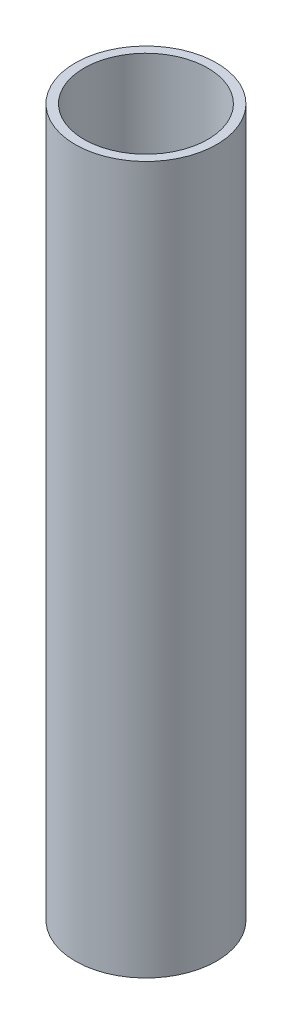
ISO-10303-21;
HEADER;
FILE_DESCRIPTION(('STEP AP214'),'2;1');
FILE_NAME('part.step','',(''),(''),'','','');
FILE_SCHEMA(('AUTOMOTIVE_DESIGN { 1 0 10303 214 1 1 1 1 }'));
ENDSEC;
DATA;
#1=APPLICATION_CONTEXT('core data for automotive mechanical design processes');
#2=APPLICATION_PROTOCOL_DEFINITION('international standard','automotive_design',2000,#1);
#3=PRODUCT_CONTEXT('',#1,'mechanical');
#4=PRODUCT('Part','Part','',(#3));
#5=PRODUCT_RELATED_PRODUCT_CATEGORY('part','',(#4));
#6=PRODUCT_DEFINITION_FORMATION('','',#4);
#7=PRODUCT_DEFINITION_CONTEXT('part definition',#1,'design');
#8=PRODUCT_DEFINITION('design','',#6,#7);
#9=PRODUCT_DEFINITION_SHAPE('','',#8);
#10=(LENGTH_UNIT() NAMED_UNIT(*) SI_UNIT(.MILLI.,.METRE.));
#11=(NAMED_UNIT(*) PLANE_ANGLE_UNIT() SI_UNIT($,.RADIAN.));
#12=(NAMED_UNIT(*) SI_UNIT($,.STERADIAN.) SOLID_ANGLE_UNIT());
#13=UNCERTAINTY_MEASURE_WITH_UNIT(LENGTH_MEASURE(1.E-05),#10,'distance_accuracy_value','');
#14=(GEOMETRIC_REPRESENTATION_CONTEXT(3) GLOBAL_UNCERTAINTY_ASSIGNED_CONTEXT((#13)) GLOBAL_UNIT_ASSIGNED_CONTEXT((#10,
#11,#12)) REPRESENTATION_CONTEXT('',''));
#15=CARTESIAN_POINT('',(0.,0.,0.));
#16=DIRECTION('',(0.,0.,1.));
#17=DIRECTION('',(1.,0.,0.));
#18=AXIS2_PLACEMENT_3D('',#15,#16,#17);
#19=CARTESIAN_POINT('',(0.,120.,0.));
#20=DIRECTION('',(0.,-1.,0.));
#21=DIRECTION('',(0.,0.,-1.));
#22=AXIS2_PLACEMENT_3D('',#19,#20,#21);
#23=CYLINDRICAL_SURFACE('',#22,12.);
#24=CARTESIAN_POINT('',(0.,120.,0.));
#25=DIRECTION('',(0.,1.,0.));
#26=DIRECTION('',(0.,0.,1.));
#27=AXIS2_PLACEMENT_3D('',#24,#25,#26);
#28=CIRCLE('',#27,12.);
#29=CARTESIAN_POINT('',(0.,120.,12.));
#30=VERTEX_POINT('',#29);
#31=EDGE_CURVE('E10',#30,#30,#28,.T.);
#32=ORIENTED_EDGE('',*,*,#31,.F.);
#33=EDGE_LOOP('',(#32));
#34=FACE_BOUND('',#33,.T.);
#35=CARTESIAN_POINT('',(0.,0.,0.));
#36=DIRECTION('',(0.,1.,0.));
#37=DIRECTION('',(0.,0.,1.));
#38=AXIS2_PLACEMENT_3D('',#35,#36,#37);
#39=CIRCLE('',#38,12.);
#40=CARTESIAN_POINT('',(0.,0.,12.));
#41=VERTEX_POINT('',#40);
#42=EDGE_CURVE('E43',#41,#41,#39,.T.);
#43=ORIENTED_EDGE('',*,*,#42,.T.);
#44=EDGE_LOOP('',(#43));
#45=FACE_BOUND('',#44,.T.);
#46=ADVANCED_FACE('F40',(#34,#45),#23,.T.);
#47=CARTESIAN_POINT('',(0.,120.,0.));
#48=DIRECTION('',(0.,1.,0.));
#49=DIRECTION('',(0.,0.,1.));
#50=AXIS2_PLACEMENT_3D('',#47,#48,#49);
#51=PLANE('',#50);
#52=CARTESIAN_POINT('',(0.,120.,0.));
#53=DIRECTION('',(0.,1.,0.));
#54=DIRECTION('',(0.,0.,1.));
#55=AXIS2_PLACEMENT_3D('',#52,#53,#54);
#56=CIRCLE('',#55,10.5);
#57=CARTESIAN_POINT('',(0.,120.,10.5));
#58=VERTEX_POINT('',#57);
#59=EDGE_CURVE('E52',#58,#58,#56,.T.);
#60=ORIENTED_EDGE('',*,*,#59,.F.);
#61=EDGE_LOOP('',(#60));
#62=FACE_BOUND('',#61,.T.);
#63=ORIENTED_EDGE('',*,*,#31,.T.);
#64=EDGE_LOOP('',(#63));
#65=FACE_BOUND('',#64,.T.);
#66=ADVANCED_FACE('F67',(#62,#65),#51,.T.);
#67=CARTESIAN_POINT('',(0.,0.,0.));
#68=DIRECTION('',(0.,1.,0.));
#69=DIRECTION('',(0.,0.,1.));
#70=AXIS2_PLACEMENT_3D('',#67,#68,#69);
#71=PLANE('',#70);
#72=ORIENTED_EDGE('',*,*,#42,.F.);
#73=EDGE_LOOP('',(#72));
#74=FACE_BOUND('',#73,.T.);
#75=ADVANCED_FACE('F63',(#74),#71,.F.);
#76=CARTESIAN_POINT('',(0.,100.,0.));
#77=DIRECTION('',(0.,1.,0.));
#78=DIRECTION('',(0.,0.,1.));
#79=AXIS2_PLACEMENT_3D('',#76,#77,#78);
#80=CYLINDRICAL_SURFACE('',#79,10.5);
#81=CARTESIAN_POINT('',(0.,100.,0.));
#82=DIRECTION('',(0.,1.,0.));
#83=DIRECTION('',(0.,0.,1.));
#84=AXIS2_PLACEMENT_3D('',#81,#82,#83);
#85=CIRCLE('',#84,10.5);
#86=CARTESIAN_POINT('',(0.,100.,10.5));
#87=VERTEX_POINT('',#86);
#88=EDGE_CURVE('E50',#87,#87,#85,.T.);
#89=ORIENTED_EDGE('',*,*,#88,.F.);
#90=EDGE_LOOP('',(#89));
#91=FACE_BOUND('',#90,.T.);
#92=ORIENTED_EDGE('',*,*,#59,.T.);
#93=EDGE_LOOP('',(#92));
#94=FACE_BOUND('',#93,.T.);
#95=ADVANCED_FACE('F60',(#91,#94),#80,.F.);
#96=CARTESIAN_POINT('',(0.,100.,0.));
#97=DIRECTION('',(0.,1.,0.));
#98=DIRECTION('',(0.,0.,1.));
#99=AXIS2_PLACEMENT_3D('',#96,#97,#98);
#100=PLANE('',#99);
#101=ORIENTED_EDGE('',*,*,#88,.T.);
#102=EDGE_LOOP('',(#101));
#103=FACE_BOUND('',#102,.T.);
#104=ADVANCED_FACE('F58',(#103),#100,.T.);
#105=CLOSED_SHELL('',(#46,#66,#75,#95,#104));
#106=MANIFOLD_SOLID_BREP('B2',#105);
#107=ADVANCED_BREP_SHAPE_REPRESENTATION('',(#18,#106),#14);
#108=SHAPE_DEFINITION_REPRESENTATION(#9,#107);
ENDSEC;
END-ISO-10303-21;
